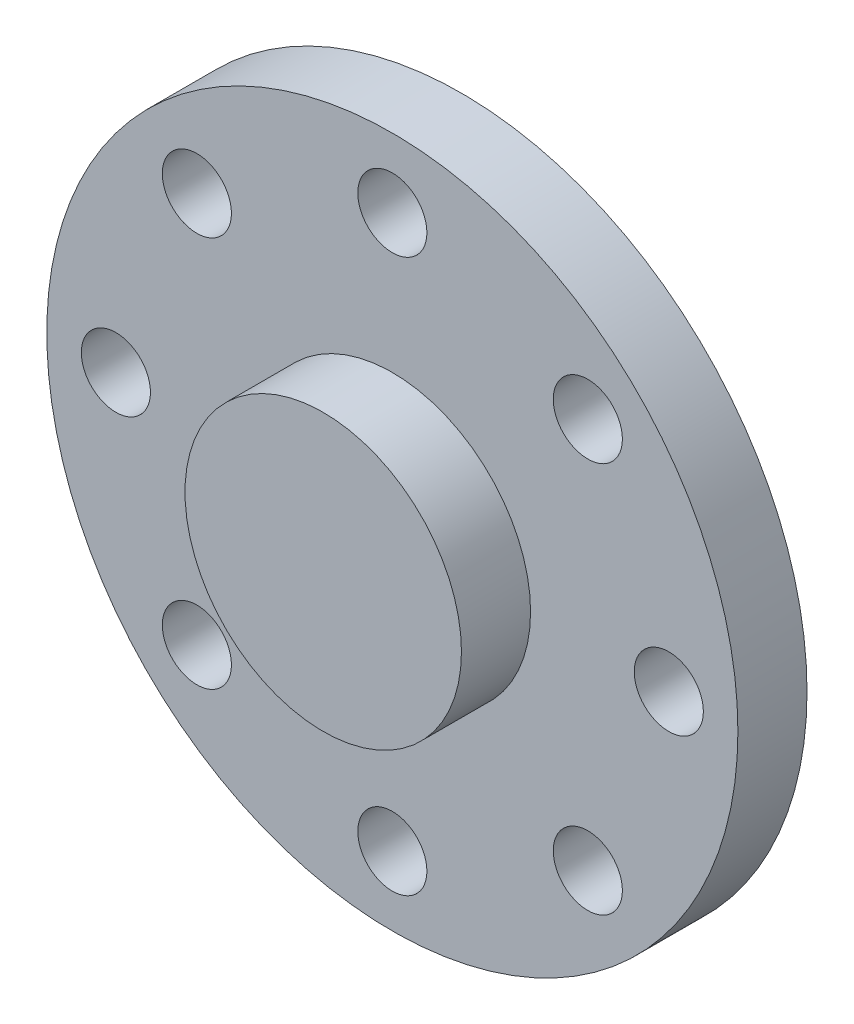
ISO-10303-21;
HEADER;
FILE_DESCRIPTION(('STEP AP214'),'2;1');
FILE_NAME('part.step','',(''),(''),'','','');
FILE_SCHEMA(('AUTOMOTIVE_DESIGN { 1 0 10303 214 1 1 1 1 }'));
ENDSEC;
DATA;
#1=APPLICATION_CONTEXT('core data for automotive mechanical design processes');
#2=APPLICATION_PROTOCOL_DEFINITION('international standard','automotive_design',2000,#1);
#3=PRODUCT_CONTEXT('',#1,'mechanical');
#4=PRODUCT('Part','Part','',(#3));
#5=PRODUCT_RELATED_PRODUCT_CATEGORY('part','',(#4));
#6=PRODUCT_DEFINITION_FORMATION('','',#4);
#7=PRODUCT_DEFINITION_CONTEXT('part definition',#1,'design');
#8=PRODUCT_DEFINITION('design','',#6,#7);
#9=PRODUCT_DEFINITION_SHAPE('','',#8);
#10=(LENGTH_UNIT() NAMED_UNIT(*) SI_UNIT(.MILLI.,.METRE.));
#11=(NAMED_UNIT(*) PLANE_ANGLE_UNIT() SI_UNIT($,.RADIAN.));
#12=(NAMED_UNIT(*) SI_UNIT($,.STERADIAN.) SOLID_ANGLE_UNIT());
#13=UNCERTAINTY_MEASURE_WITH_UNIT(LENGTH_MEASURE(1.E-05),#10,'distance_accuracy_value','');
#14=(GEOMETRIC_REPRESENTATION_CONTEXT(3) GLOBAL_UNCERTAINTY_ASSIGNED_CONTEXT((#13)) GLOBAL_UNIT_ASSIGNED_CONTEXT((#10,
#11,#12)) REPRESENTATION_CONTEXT('',''));
#15=CARTESIAN_POINT('',(0.,0.,0.));
#16=DIRECTION('',(0.,0.,1.));
#17=DIRECTION('',(1.,0.,0.));
#18=AXIS2_PLACEMENT_3D('',#15,#16,#17);
#19=CARTESIAN_POINT('',(22.1496616230781,25.8801690657236,2.));
#20=DIRECTION('',(0.,0.,-1.));
#21=DIRECTION('',(-1.,0.,0.));
#22=AXIS2_PLACEMENT_3D('',#19,#20,#21);
#23=CYLINDRICAL_SURFACE('',#22,1.);
#24=CARTESIAN_POINT('',(22.1496616230781,25.8801690657236,2.));
#25=DIRECTION('',(0.,0.,1.));
#26=DIRECTION('',(1.,0.,0.));
#27=AXIS2_PLACEMENT_3D('',#24,#25,#26);
#28=CIRCLE('',#27,1.);
#29=CARTESIAN_POINT('',(23.1496616230781,25.8801690657236,2.));
#30=VERTEX_POINT('',#29);
#31=EDGE_CURVE('E46',#30,#30,#28,.T.);
#32=ORIENTED_EDGE('',*,*,#31,.T.);
#33=EDGE_LOOP('',(#32));
#34=FACE_BOUND('',#33,.T.);
#35=CARTESIAN_POINT('',(22.1496616230781,25.8801690657236,0.));
#36=DIRECTION('',(0.,0.,1.));
#37=DIRECTION('',(1.,0.,0.));
#38=AXIS2_PLACEMENT_3D('',#35,#36,#37);
#39=CIRCLE('',#38,1.);
#40=CARTESIAN_POINT('',(23.1496616230781,25.8801690657236,0.));
#41=VERTEX_POINT('',#40);
#42=EDGE_CURVE('E94',#41,#41,#39,.T.);
#43=ORIENTED_EDGE('',*,*,#42,.F.);
#44=EDGE_LOOP('',(#43));
#45=FACE_BOUND('',#44,.T.);
#46=ADVANCED_FACE('F33',(#34,#45),#23,.F.);
#47=CARTESIAN_POINT('',(27.8065158725705,23.537023315216,2.));
#48=DIRECTION('',(0.,0.,-1.));
#49=DIRECTION('',(-1.,0.,0.));
#50=AXIS2_PLACEMENT_3D('',#47,#48,#49);
#51=CYLINDRICAL_SURFACE('',#50,1.);
#52=CARTESIAN_POINT('',(27.8065158725705,23.537023315216,2.));
#53=DIRECTION('',(0.,0.,1.));
#54=DIRECTION('',(1.,0.,0.));
#55=AXIS2_PLACEMENT_3D('',#52,#53,#54);
#56=CIRCLE('',#55,1.);
#57=CARTESIAN_POINT('',(28.8065158725705,23.537023315216,2.));
#58=VERTEX_POINT('',#57);
#59=EDGE_CURVE('E69',#58,#58,#56,.T.);
#60=ORIENTED_EDGE('',*,*,#59,.T.);
#61=EDGE_LOOP('',(#60));
#62=FACE_BOUND('',#61,.T.);
#63=CARTESIAN_POINT('',(27.8065158725705,23.537023315216,0.));
#64=DIRECTION('',(0.,0.,1.));
#65=DIRECTION('',(1.,0.,0.));
#66=AXIS2_PLACEMENT_3D('',#63,#64,#65);
#67=CIRCLE('',#66,1.);
#68=CARTESIAN_POINT('',(28.8065158725705,23.537023315216,0.));
#69=VERTEX_POINT('',#68);
#70=EDGE_CURVE('E92',#69,#69,#67,.T.);
#71=ORIENTED_EDGE('',*,*,#70,.F.);
#72=EDGE_LOOP('',(#71));
#73=FACE_BOUND('',#72,.T.);
#74=ADVANCED_FACE('F119',(#62,#73),#51,.F.);
#75=CARTESIAN_POINT('',(27.8065158725705,12.2233148162312,2.));
#76=DIRECTION('',(0.,0.,-1.));
#77=DIRECTION('',(-1.,0.,0.));
#78=AXIS2_PLACEMENT_3D('',#75,#76,#77);
#79=CYLINDRICAL_SURFACE('',#78,1.);
#80=CARTESIAN_POINT('',(27.8065158725705,12.2233148162312,2.));
#81=DIRECTION('',(0.,0.,1.));
#82=DIRECTION('',(1.,0.,0.));
#83=AXIS2_PLACEMENT_3D('',#80,#81,#82);
#84=CIRCLE('',#83,1.);
#85=CARTESIAN_POINT('',(28.8065158725705,12.2233148162312,2.));
#86=VERTEX_POINT('',#85);
#87=EDGE_CURVE('E66',#86,#86,#84,.T.);
#88=ORIENTED_EDGE('',*,*,#87,.T.);
#89=EDGE_LOOP('',(#88));
#90=FACE_BOUND('',#89,.T.);
#91=CARTESIAN_POINT('',(27.8065158725705,12.2233148162312,0.));
#92=DIRECTION('',(0.,0.,1.));
#93=DIRECTION('',(1.,0.,0.));
#94=AXIS2_PLACEMENT_3D('',#91,#92,#93);
#95=CIRCLE('',#94,1.);
#96=CARTESIAN_POINT('',(28.8065158725705,12.2233148162312,0.));
#97=VERTEX_POINT('',#96);
#98=EDGE_CURVE('E89',#97,#97,#95,.T.);
#99=ORIENTED_EDGE('',*,*,#98,.F.);
#100=EDGE_LOOP('',(#99));
#101=FACE_BOUND('',#100,.T.);
#102=ADVANCED_FACE('F124',(#90,#101),#79,.F.);
#103=CARTESIAN_POINT('',(16.4928073735857,23.537023315216,2.));
#104=DIRECTION('',(0.,0.,-1.));
#105=DIRECTION('',(-1.,0.,0.));
#106=AXIS2_PLACEMENT_3D('',#103,#104,#105);
#107=CYLINDRICAL_SURFACE('',#106,1.);
#108=CARTESIAN_POINT('',(16.4928073735857,23.537023315216,2.));
#109=DIRECTION('',(0.,0.,1.));
#110=DIRECTION('',(1.,0.,0.));
#111=AXIS2_PLACEMENT_3D('',#108,#109,#110);
#112=CIRCLE('',#111,1.);
#113=CARTESIAN_POINT('',(17.4928073735857,23.537023315216,2.));
#114=VERTEX_POINT('',#113);
#115=EDGE_CURVE('E63',#114,#114,#112,.T.);
#116=ORIENTED_EDGE('',*,*,#115,.T.);
#117=EDGE_LOOP('',(#116));
#118=FACE_BOUND('',#117,.T.);
#119=CARTESIAN_POINT('',(16.4928073735857,23.537023315216,0.));
#120=DIRECTION('',(0.,0.,1.));
#121=DIRECTION('',(1.,0.,0.));
#122=AXIS2_PLACEMENT_3D('',#119,#120,#121);
#123=CIRCLE('',#122,1.);
#124=CARTESIAN_POINT('',(17.4928073735857,23.537023315216,0.));
#125=VERTEX_POINT('',#124);
#126=EDGE_CURVE('E86',#125,#125,#123,.T.);
#127=ORIENTED_EDGE('',*,*,#126,.F.);
#128=EDGE_LOOP('',(#127));
#129=FACE_BOUND('',#128,.T.);
#130=ADVANCED_FACE('F131',(#118,#129),#107,.F.);
#131=CARTESIAN_POINT('',(14.1496616230781,17.8801690657236,2.));
#132=DIRECTION('',(0.,0.,-1.));
#133=DIRECTION('',(-1.,0.,0.));
#134=AXIS2_PLACEMENT_3D('',#131,#132,#133);
#135=CYLINDRICAL_SURFACE('',#134,1.);
#136=CARTESIAN_POINT('',(14.1496616230781,17.8801690657236,2.));
#137=DIRECTION('',(0.,0.,1.));
#138=DIRECTION('',(1.,0.,0.));
#139=AXIS2_PLACEMENT_3D('',#136,#137,#138);
#140=CIRCLE('',#139,1.);
#141=CARTESIAN_POINT('',(15.1496616230781,17.8801690657236,2.));
#142=VERTEX_POINT('',#141);
#143=EDGE_CURVE('E60',#142,#142,#140,.T.);
#144=ORIENTED_EDGE('',*,*,#143,.T.);
#145=EDGE_LOOP('',(#144));
#146=FACE_BOUND('',#145,.T.);
#147=CARTESIAN_POINT('',(14.1496616230781,17.8801690657236,0.));
#148=DIRECTION('',(0.,0.,1.));
#149=DIRECTION('',(1.,0.,0.));
#150=AXIS2_PLACEMENT_3D('',#147,#148,#149);
#151=CIRCLE('',#150,1.);
#152=CARTESIAN_POINT('',(15.1496616230781,17.8801690657236,0.));
#153=VERTEX_POINT('',#152);
#154=EDGE_CURVE('E83',#153,#153,#151,.T.);
#155=ORIENTED_EDGE('',*,*,#154,.F.);
#156=EDGE_LOOP('',(#155));
#157=FACE_BOUND('',#156,.T.);
#158=ADVANCED_FACE('F135',(#146,#157),#135,.F.);
#159=CARTESIAN_POINT('',(22.1496616230781,9.88016906572357,2.));
#160=DIRECTION('',(0.,0.,-1.));
#161=DIRECTION('',(-1.,0.,0.));
#162=AXIS2_PLACEMENT_3D('',#159,#160,#161);
#163=CYLINDRICAL_SURFACE('',#162,1.);
#164=CARTESIAN_POINT('',(22.1496616230781,9.88016906572357,2.));
#165=DIRECTION('',(0.,0.,1.));
#166=DIRECTION('',(1.,0.,0.));
#167=AXIS2_PLACEMENT_3D('',#164,#165,#166);
#168=CIRCLE('',#167,1.);
#169=CARTESIAN_POINT('',(23.1496616230781,9.88016906572357,2.));
#170=VERTEX_POINT('',#169);
#171=EDGE_CURVE('E57',#170,#170,#168,.T.);
#172=ORIENTED_EDGE('',*,*,#171,.T.);
#173=EDGE_LOOP('',(#172));
#174=FACE_BOUND('',#173,.T.);
#175=CARTESIAN_POINT('',(22.1496616230781,9.88016906572357,0.));
#176=DIRECTION('',(0.,0.,1.));
#177=DIRECTION('',(1.,0.,0.));
#178=AXIS2_PLACEMENT_3D('',#175,#176,#177);
#179=CIRCLE('',#178,1.);
#180=CARTESIAN_POINT('',(23.1496616230781,9.88016906572357,0.));
#181=VERTEX_POINT('',#180);
#182=EDGE_CURVE('E80',#181,#181,#179,.T.);
#183=ORIENTED_EDGE('',*,*,#182,.F.);
#184=EDGE_LOOP('',(#183));
#185=FACE_BOUND('',#184,.T.);
#186=ADVANCED_FACE('F139',(#174,#185),#163,.F.);
#187=CARTESIAN_POINT('',(16.4928073735857,12.2233148162312,2.));
#188=DIRECTION('',(0.,0.,-1.));
#189=DIRECTION('',(-1.,0.,0.));
#190=AXIS2_PLACEMENT_3D('',#187,#188,#189);
#191=CYLINDRICAL_SURFACE('',#190,1.);
#192=CARTESIAN_POINT('',(16.4928073735857,12.2233148162312,2.));
#193=DIRECTION('',(0.,0.,1.));
#194=DIRECTION('',(1.,0.,0.));
#195=AXIS2_PLACEMENT_3D('',#192,#193,#194);
#196=CIRCLE('',#195,1.);
#197=CARTESIAN_POINT('',(17.4928073735857,12.2233148162312,2.));
#198=VERTEX_POINT('',#197);
#199=EDGE_CURVE('E54',#198,#198,#196,.T.);
#200=ORIENTED_EDGE('',*,*,#199,.T.);
#201=EDGE_LOOP('',(#200));
#202=FACE_BOUND('',#201,.T.);
#203=CARTESIAN_POINT('',(16.4928073735857,12.2233148162312,0.));
#204=DIRECTION('',(0.,0.,1.));
#205=DIRECTION('',(1.,0.,0.));
#206=AXIS2_PLACEMENT_3D('',#203,#204,#205);
#207=CIRCLE('',#206,1.);
#208=CARTESIAN_POINT('',(17.4928073735857,12.2233148162312,0.));
#209=VERTEX_POINT('',#208);
#210=EDGE_CURVE('E77',#209,#209,#207,.T.);
#211=ORIENTED_EDGE('',*,*,#210,.F.);
#212=EDGE_LOOP('',(#211));
#213=FACE_BOUND('',#212,.T.);
#214=ADVANCED_FACE('F114',(#202,#213),#191,.F.);
#215=CARTESIAN_POINT('',(22.1496616230781,17.8801690657236,2.));
#216=DIRECTION('',(0.,0.,-1.));
#217=DIRECTION('',(-1.,0.,0.));
#218=AXIS2_PLACEMENT_3D('',#215,#216,#217);
#219=CYLINDRICAL_SURFACE('',#218,10.);
#220=CARTESIAN_POINT('',(22.1496616230781,17.8801690657236,2.));
#221=DIRECTION('',(0.,0.,1.));
#222=DIRECTION('',(1.,0.,0.));
#223=AXIS2_PLACEMENT_3D('',#220,#221,#222);
#224=CIRCLE('',#223,10.);
#225=CARTESIAN_POINT('',(32.1496616230781,17.8801690657236,2.));
#226=VERTEX_POINT('',#225);
#227=EDGE_CURVE('E51',#226,#226,#224,.T.);
#228=ORIENTED_EDGE('',*,*,#227,.F.);
#229=EDGE_LOOP('',(#228));
#230=FACE_BOUND('',#229,.T.);
#231=CARTESIAN_POINT('',(22.1496616230781,17.8801690657236,0.));
#232=DIRECTION('',(0.,0.,1.));
#233=DIRECTION('',(1.,0.,0.));
#234=AXIS2_PLACEMENT_3D('',#231,#232,#233);
#235=CIRCLE('',#234,10.);
#236=CARTESIAN_POINT('',(32.1496616230781,17.8801690657236,0.));
#237=VERTEX_POINT('',#236);
#238=EDGE_CURVE('E74',#237,#237,#235,.T.);
#239=ORIENTED_EDGE('',*,*,#238,.T.);
#240=EDGE_LOOP('',(#239));
#241=FACE_BOUND('',#240,.T.);
#242=ADVANCED_FACE('F35',(#230,#241),#219,.T.);
#243=CARTESIAN_POINT('',(30.1496616230781,17.8801690657236,2.));
#244=DIRECTION('',(0.,0.,-1.));
#245=DIRECTION('',(-1.,0.,0.));
#246=AXIS2_PLACEMENT_3D('',#243,#244,#245);
#247=CYLINDRICAL_SURFACE('',#246,1.);
#248=CARTESIAN_POINT('',(30.1496616230781,17.8801690657236,2.));
#249=DIRECTION('',(0.,0.,1.));
#250=DIRECTION('',(1.,0.,0.));
#251=AXIS2_PLACEMENT_3D('',#248,#249,#250);
#252=CIRCLE('',#251,1.);
#253=CARTESIAN_POINT('',(31.1496616230781,17.8801690657236,2.));
#254=VERTEX_POINT('',#253);
#255=EDGE_CURVE('E41',#254,#254,#252,.T.);
#256=ORIENTED_EDGE('',*,*,#255,.T.);
#257=EDGE_LOOP('',(#256));
#258=FACE_BOUND('',#257,.T.);
#259=CARTESIAN_POINT('',(30.1496616230781,17.8801690657236,0.));
#260=DIRECTION('',(0.,0.,1.));
#261=DIRECTION('',(1.,0.,0.));
#262=AXIS2_PLACEMENT_3D('',#259,#260,#261);
#263=CIRCLE('',#262,1.);
#264=CARTESIAN_POINT('',(31.1496616230781,17.8801690657236,0.));
#265=VERTEX_POINT('',#264);
#266=EDGE_CURVE('E37',#265,#265,#263,.T.);
#267=ORIENTED_EDGE('',*,*,#266,.F.);
#268=EDGE_LOOP('',(#267));
#269=FACE_BOUND('',#268,.T.);
#270=ADVANCED_FACE('F103',(#258,#269),#247,.F.);
#271=CARTESIAN_POINT('',(0.,0.,2.));
#272=DIRECTION('',(0.,0.,1.));
#273=DIRECTION('',(1.,0.,0.));
#274=AXIS2_PLACEMENT_3D('',#271,#272,#273);
#275=PLANE('',#274);
#276=CARTESIAN_POINT('',(22.1496616230781,17.8801690657236,2.));
#277=DIRECTION('',(0.,0.,1.));
#278=DIRECTION('',(1.,0.,0.));
#279=AXIS2_PLACEMENT_3D('',#276,#277,#278);
#280=CIRCLE('',#279,4.);
#281=CARTESIAN_POINT('',(26.1496616230781,17.8801690657236,2.));
#282=VERTEX_POINT('',#281);
#283=EDGE_CURVE('E10',#282,#282,#280,.T.);
#284=ORIENTED_EDGE('',*,*,#283,.F.);
#285=EDGE_LOOP('',(#284));
#286=FACE_BOUND('',#285,.T.);
#287=ORIENTED_EDGE('',*,*,#227,.T.);
#288=EDGE_LOOP('',(#287));
#289=FACE_BOUND('',#288,.T.);
#290=ORIENTED_EDGE('',*,*,#199,.F.);
#291=EDGE_LOOP('',(#290));
#292=FACE_BOUND('',#291,.T.);
#293=ORIENTED_EDGE('',*,*,#171,.F.);
#294=EDGE_LOOP('',(#293));
#295=FACE_BOUND('',#294,.T.);
#296=ORIENTED_EDGE('',*,*,#143,.F.);
#297=EDGE_LOOP('',(#296));
#298=FACE_BOUND('',#297,.T.);
#299=ORIENTED_EDGE('',*,*,#115,.F.);
#300=EDGE_LOOP('',(#299));
#301=FACE_BOUND('',#300,.T.);
#302=ORIENTED_EDGE('',*,*,#87,.F.);
#303=EDGE_LOOP('',(#302));
#304=FACE_BOUND('',#303,.T.);
#305=ORIENTED_EDGE('',*,*,#59,.F.);
#306=EDGE_LOOP('',(#305));
#307=FACE_BOUND('',#306,.T.);
#308=ORIENTED_EDGE('',*,*,#31,.F.);
#309=EDGE_LOOP('',(#308));
#310=FACE_BOUND('',#309,.T.);
#311=ORIENTED_EDGE('',*,*,#255,.F.);
#312=EDGE_LOOP('',(#311));
#313=FACE_BOUND('',#312,.T.);
#314=ADVANCED_FACE('F105',(#286,#289,#292,#295,#298,#301,#304,#307,#310,#313),#275,.T.);
#315=CARTESIAN_POINT('',(0.,0.,0.));
#316=DIRECTION('',(0.,0.,1.));
#317=DIRECTION('',(1.,0.,0.));
#318=AXIS2_PLACEMENT_3D('',#315,#316,#317);
#319=PLANE('',#318);
#320=ORIENTED_EDGE('',*,*,#238,.F.);
#321=EDGE_LOOP('',(#320));
#322=FACE_BOUND('',#321,.T.);
#323=ORIENTED_EDGE('',*,*,#210,.T.);
#324=EDGE_LOOP('',(#323));
#325=FACE_BOUND('',#324,.T.);
#326=ORIENTED_EDGE('',*,*,#182,.T.);
#327=EDGE_LOOP('',(#326));
#328=FACE_BOUND('',#327,.T.);
#329=ORIENTED_EDGE('',*,*,#154,.T.);
#330=EDGE_LOOP('',(#329));
#331=FACE_BOUND('',#330,.T.);
#332=ORIENTED_EDGE('',*,*,#126,.T.);
#333=EDGE_LOOP('',(#332));
#334=FACE_BOUND('',#333,.T.);
#335=ORIENTED_EDGE('',*,*,#98,.T.);
#336=EDGE_LOOP('',(#335));
#337=FACE_BOUND('',#336,.T.);
#338=ORIENTED_EDGE('',*,*,#70,.T.);
#339=EDGE_LOOP('',(#338));
#340=FACE_BOUND('',#339,.T.);
#341=ORIENTED_EDGE('',*,*,#42,.T.);
#342=EDGE_LOOP('',(#341));
#343=FACE_BOUND('',#342,.T.);
#344=ORIENTED_EDGE('',*,*,#266,.T.);
#345=EDGE_LOOP('',(#344));
#346=FACE_BOUND('',#345,.T.);
#347=ADVANCED_FACE('F101',(#322,#325,#328,#331,#334,#337,#340,#343,#346),#319,.F.);
#348=CARTESIAN_POINT('',(22.1496616230781,17.8801690657236,4.));
#349=DIRECTION('',(0.,0.,-1.));
#350=DIRECTION('',(-1.,0.,0.));
#351=AXIS2_PLACEMENT_3D('',#348,#349,#350);
#352=CYLINDRICAL_SURFACE('',#351,4.);
#353=CARTESIAN_POINT('',(22.1496616230781,17.8801690657236,4.));
#354=DIRECTION('',(0.,0.,1.));
#355=DIRECTION('',(1.,0.,0.));
#356=AXIS2_PLACEMENT_3D('',#353,#354,#355);
#357=CIRCLE('',#356,4.);
#358=CARTESIAN_POINT('',(26.1496616230781,17.8801690657236,4.));
#359=VERTEX_POINT('',#358);
#360=EDGE_CURVE('E50',#359,#359,#357,.T.);
#361=ORIENTED_EDGE('',*,*,#360,.F.);
#362=EDGE_LOOP('',(#361));
#363=FACE_BOUND('',#362,.T.);
#364=ORIENTED_EDGE('',*,*,#283,.T.);
#365=EDGE_LOOP('',(#364));
#366=FACE_BOUND('',#365,.T.);
#367=ADVANCED_FACE('F153',(#363,#366),#352,.T.);
#368=CARTESIAN_POINT('',(0.,0.,4.));
#369=DIRECTION('',(0.,0.,1.));
#370=DIRECTION('',(1.,0.,0.));
#371=AXIS2_PLACEMENT_3D('',#368,#369,#370);
#372=PLANE('',#371);
#373=ORIENTED_EDGE('',*,*,#360,.T.);
#374=EDGE_LOOP('',(#373));
#375=FACE_BOUND('',#374,.T.);
#376=ADVANCED_FACE('F172',(#375),#372,.T.);
#377=CLOSED_SHELL('',(#46,#74,#102,#130,#158,#186,#214,#242,#270,#314,#347,#367,#376));
#378=MANIFOLD_SOLID_BREP('B2',#377);
#379=ADVANCED_BREP_SHAPE_REPRESENTATION('',(#18,#378),#14);
#380=SHAPE_DEFINITION_REPRESENTATION(#9,#379);
ENDSEC;
END-ISO-10303-21;
